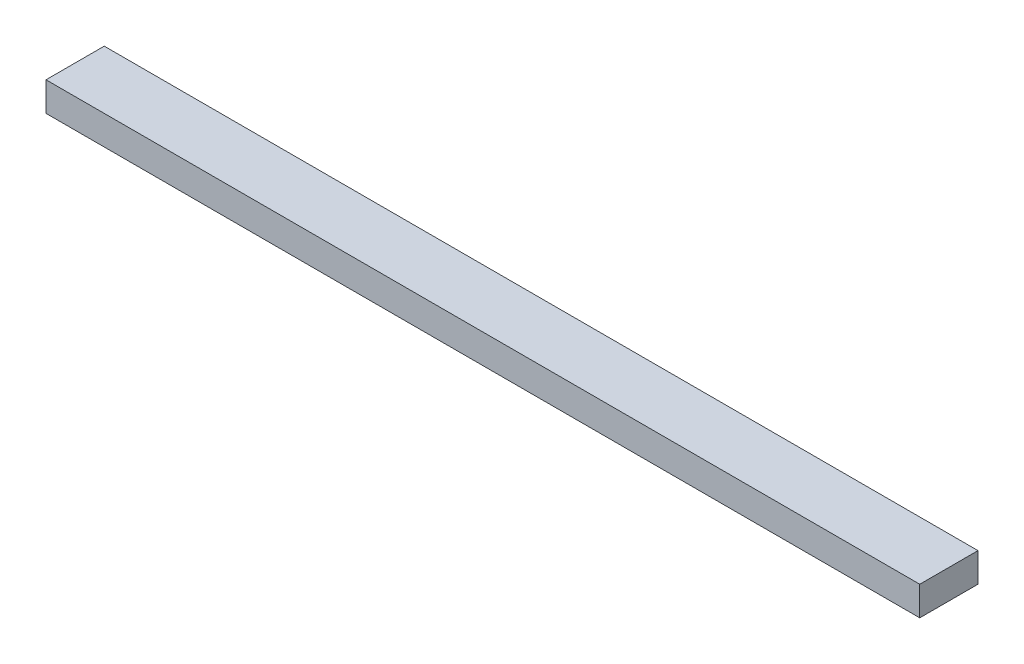
ISO-10303-21;
HEADER;
FILE_DESCRIPTION(('STEP AP214'),'2;1');
FILE_NAME('part.step','',(''),(''),'','','');
FILE_SCHEMA(('AUTOMOTIVE_DESIGN { 1 0 10303 214 1 1 1 1 }'));
ENDSEC;
DATA;
#1=APPLICATION_CONTEXT('core data for automotive mechanical design processes');
#2=APPLICATION_PROTOCOL_DEFINITION('international standard','automotive_design',2000,#1);
#3=PRODUCT_CONTEXT('',#1,'mechanical');
#4=PRODUCT('Part','Part','',(#3));
#5=PRODUCT_RELATED_PRODUCT_CATEGORY('part','',(#4));
#6=PRODUCT_DEFINITION_FORMATION('','',#4);
#7=PRODUCT_DEFINITION_CONTEXT('part definition',#1,'design');
#8=PRODUCT_DEFINITION('design','',#6,#7);
#9=PRODUCT_DEFINITION_SHAPE('','',#8);
#10=(LENGTH_UNIT() NAMED_UNIT(*) SI_UNIT(.MILLI.,.METRE.));
#11=(NAMED_UNIT(*) PLANE_ANGLE_UNIT() SI_UNIT($,.RADIAN.));
#12=(NAMED_UNIT(*) SI_UNIT($,.STERADIAN.) SOLID_ANGLE_UNIT());
#13=UNCERTAINTY_MEASURE_WITH_UNIT(LENGTH_MEASURE(1.E-05),#10,'distance_accuracy_value','');
#14=(GEOMETRIC_REPRESENTATION_CONTEXT(3) GLOBAL_UNCERTAINTY_ASSIGNED_CONTEXT((#13)) GLOBAL_UNIT_ASSIGNED_CONTEXT((#10,
#11,#12)) REPRESENTATION_CONTEXT('',''));
#15=CARTESIAN_POINT('',(0.,0.,0.));
#16=DIRECTION('',(0.,0.,1.));
#17=DIRECTION('',(1.,0.,0.));
#18=AXIS2_PLACEMENT_3D('',#15,#16,#17);
#19=CARTESIAN_POINT('',(150.,10.,-10.));
#20=DIRECTION('',(-1.,0.,0.));
#21=DIRECTION('',(0.,0.,1.));
#22=AXIS2_PLACEMENT_3D('',#19,#20,#21);
#23=PLANE('',#22);
#24=DIRECTION('',(0.,0.,-1.));
#25=VECTOR('',#24,1.);
#26=CARTESIAN_POINT('',(150.,0.,-10.));
#27=LINE('',#26,#25);
#28=CARTESIAN_POINT('',(150.,0.,10.));
#29=VERTEX_POINT('',#28);
#30=CARTESIAN_POINT('',(150.,0.,-10.));
#31=VERTEX_POINT('',#30);
#32=EDGE_CURVE('E102',#29,#31,#27,.T.);
#33=ORIENTED_EDGE('',*,*,#32,.T.);
#34=DIRECTION('',(0.,-1.,0.));
#35=VECTOR('',#34,1.);
#36=CARTESIAN_POINT('',(150.,10.,-10.));
#37=LINE('',#36,#35);
#38=CARTESIAN_POINT('',(150.,10.,-10.));
#39=VERTEX_POINT('',#38);
#40=EDGE_CURVE('E11',#39,#31,#37,.T.);
#41=ORIENTED_EDGE('',*,*,#40,.F.);
#42=DIRECTION('',(0.,0.,-1.));
#43=VECTOR('',#42,1.);
#44=CARTESIAN_POINT('',(150.,10.,-10.));
#45=LINE('',#44,#43);
#46=CARTESIAN_POINT('',(150.,10.,10.));
#47=VERTEX_POINT('',#46);
#48=EDGE_CURVE('E90',#47,#39,#45,.T.);
#49=ORIENTED_EDGE('',*,*,#48,.F.);
#50=DIRECTION('',(0.,-1.,0.));
#51=VECTOR('',#50,1.);
#52=CARTESIAN_POINT('',(150.,10.,10.));
#53=LINE('',#52,#51);
#54=EDGE_CURVE('E98',#47,#29,#53,.T.);
#55=ORIENTED_EDGE('',*,*,#54,.T.);
#56=EDGE_LOOP('',(#33,#41,#49,#55));
#57=FACE_BOUND('',#56,.T.);
#58=ADVANCED_FACE('F39',(#57),#23,.F.);
#59=CARTESIAN_POINT('',(-150.,10.,-10.));
#60=DIRECTION('',(0.,0.,1.));
#61=DIRECTION('',(1.,0.,0.));
#62=AXIS2_PLACEMENT_3D('',#59,#60,#61);
#63=PLANE('',#62);
#64=DIRECTION('',(-1.,0.,0.));
#65=VECTOR('',#64,1.);
#66=CARTESIAN_POINT('',(-150.,0.,-10.));
#67=LINE('',#66,#65);
#68=CARTESIAN_POINT('',(-150.,0.,-10.));
#69=VERTEX_POINT('',#68);
#70=EDGE_CURVE('E94',#31,#69,#67,.T.);
#71=ORIENTED_EDGE('',*,*,#70,.T.);
#72=DIRECTION('',(0.,-1.,0.));
#73=VECTOR('',#72,1.);
#74=CARTESIAN_POINT('',(-150.,10.,-10.));
#75=LINE('',#74,#73);
#76=CARTESIAN_POINT('',(-150.,10.,-10.));
#77=VERTEX_POINT('',#76);
#78=EDGE_CURVE('E47',#77,#69,#75,.T.);
#79=ORIENTED_EDGE('',*,*,#78,.F.);
#80=DIRECTION('',(-1.,0.,0.));
#81=VECTOR('',#80,1.);
#82=CARTESIAN_POINT('',(-150.,10.,-10.));
#83=LINE('',#82,#81);
#84=EDGE_CURVE('E85',#39,#77,#83,.T.);
#85=ORIENTED_EDGE('',*,*,#84,.F.);
#86=ORIENTED_EDGE('',*,*,#40,.T.);
#87=EDGE_LOOP('',(#71,#79,#85,#86));
#88=FACE_BOUND('',#87,.T.);
#89=ADVANCED_FACE('F93',(#88),#63,.F.);
#90=CARTESIAN_POINT('',(-150.,10.,-10.));
#91=DIRECTION('',(1.,0.,0.));
#92=DIRECTION('',(0.,0.,-1.));
#93=AXIS2_PLACEMENT_3D('',#90,#91,#92);
#94=PLANE('',#93);
#95=DIRECTION('',(0.,0.,1.));
#96=VECTOR('',#95,1.);
#97=CARTESIAN_POINT('',(-150.,0.,-10.));
#98=LINE('',#97,#96);
#99=CARTESIAN_POINT('',(-150.,0.,10.));
#100=VERTEX_POINT('',#99);
#101=EDGE_CURVE('E72',#69,#100,#98,.T.);
#102=ORIENTED_EDGE('',*,*,#101,.T.);
#103=DIRECTION('',(0.,-1.,0.));
#104=VECTOR('',#103,1.);
#105=CARTESIAN_POINT('',(-150.,10.,10.));
#106=LINE('',#105,#104);
#107=CARTESIAN_POINT('',(-150.,10.,10.));
#108=VERTEX_POINT('',#107);
#109=EDGE_CURVE('E95',#108,#100,#106,.T.);
#110=ORIENTED_EDGE('',*,*,#109,.F.);
#111=DIRECTION('',(0.,0.,1.));
#112=VECTOR('',#111,1.);
#113=CARTESIAN_POINT('',(-150.,10.,-10.));
#114=LINE('',#113,#112);
#115=EDGE_CURVE('E88',#77,#108,#114,.T.);
#116=ORIENTED_EDGE('',*,*,#115,.F.);
#117=ORIENTED_EDGE('',*,*,#78,.T.);
#118=EDGE_LOOP('',(#102,#110,#116,#117));
#119=FACE_BOUND('',#118,.T.);
#120=ADVANCED_FACE('F96',(#119),#94,.F.);
#121=CARTESIAN_POINT('',(-150.,10.,10.));
#122=DIRECTION('',(0.,0.,-1.));
#123=DIRECTION('',(-1.,0.,0.));
#124=AXIS2_PLACEMENT_3D('',#121,#122,#123);
#125=PLANE('',#124);
#126=DIRECTION('',(1.,0.,0.));
#127=VECTOR('',#126,1.);
#128=CARTESIAN_POINT('',(-150.,0.,10.));
#129=LINE('',#128,#127);
#130=EDGE_CURVE('E78',#100,#29,#129,.T.);
#131=ORIENTED_EDGE('',*,*,#130,.T.);
#132=ORIENTED_EDGE('',*,*,#54,.F.);
#133=DIRECTION('',(1.,0.,0.));
#134=VECTOR('',#133,1.);
#135=CARTESIAN_POINT('',(-150.,10.,10.));
#136=LINE('',#135,#134);
#137=EDGE_CURVE('E55',#108,#47,#136,.T.);
#138=ORIENTED_EDGE('',*,*,#137,.F.);
#139=ORIENTED_EDGE('',*,*,#109,.T.);
#140=EDGE_LOOP('',(#131,#132,#138,#139));
#141=FACE_BOUND('',#140,.T.);
#142=ADVANCED_FACE('F109',(#141),#125,.F.);
#143=CARTESIAN_POINT('',(0.,10.,0.));
#144=DIRECTION('',(0.,1.,0.));
#145=DIRECTION('',(0.,0.,1.));
#146=AXIS2_PLACEMENT_3D('',#143,#144,#145);
#147=PLANE('',#146);
#148=ORIENTED_EDGE('',*,*,#48,.T.);
#149=ORIENTED_EDGE('',*,*,#84,.T.);
#150=ORIENTED_EDGE('',*,*,#115,.T.);
#151=ORIENTED_EDGE('',*,*,#137,.T.);
#152=EDGE_LOOP('',(#148,#149,#150,#151));
#153=FACE_BOUND('',#152,.T.);
#154=ADVANCED_FACE('F86',(#153),#147,.T.);
#155=CARTESIAN_POINT('',(0.,0.,0.));
#156=DIRECTION('',(0.,1.,0.));
#157=DIRECTION('',(0.,0.,1.));
#158=AXIS2_PLACEMENT_3D('',#155,#156,#157);
#159=PLANE('',#158);
#160=ORIENTED_EDGE('',*,*,#32,.F.);
#161=ORIENTED_EDGE('',*,*,#130,.F.);
#162=ORIENTED_EDGE('',*,*,#101,.F.);
#163=ORIENTED_EDGE('',*,*,#70,.F.);
#164=EDGE_LOOP('',(#160,#161,#162,#163));
#165=FACE_BOUND('',#164,.T.);
#166=ADVANCED_FACE('F112',(#165),#159,.F.);
#167=CLOSED_SHELL('',(#58,#89,#120,#142,#154,#166));
#168=MANIFOLD_SOLID_BREP('B2',#167);
#169=ADVANCED_BREP_SHAPE_REPRESENTATION('',(#18,#168),#14);
#170=SHAPE_DEFINITION_REPRESENTATION(#9,#169);
ENDSEC;
END-ISO-10303-21;
